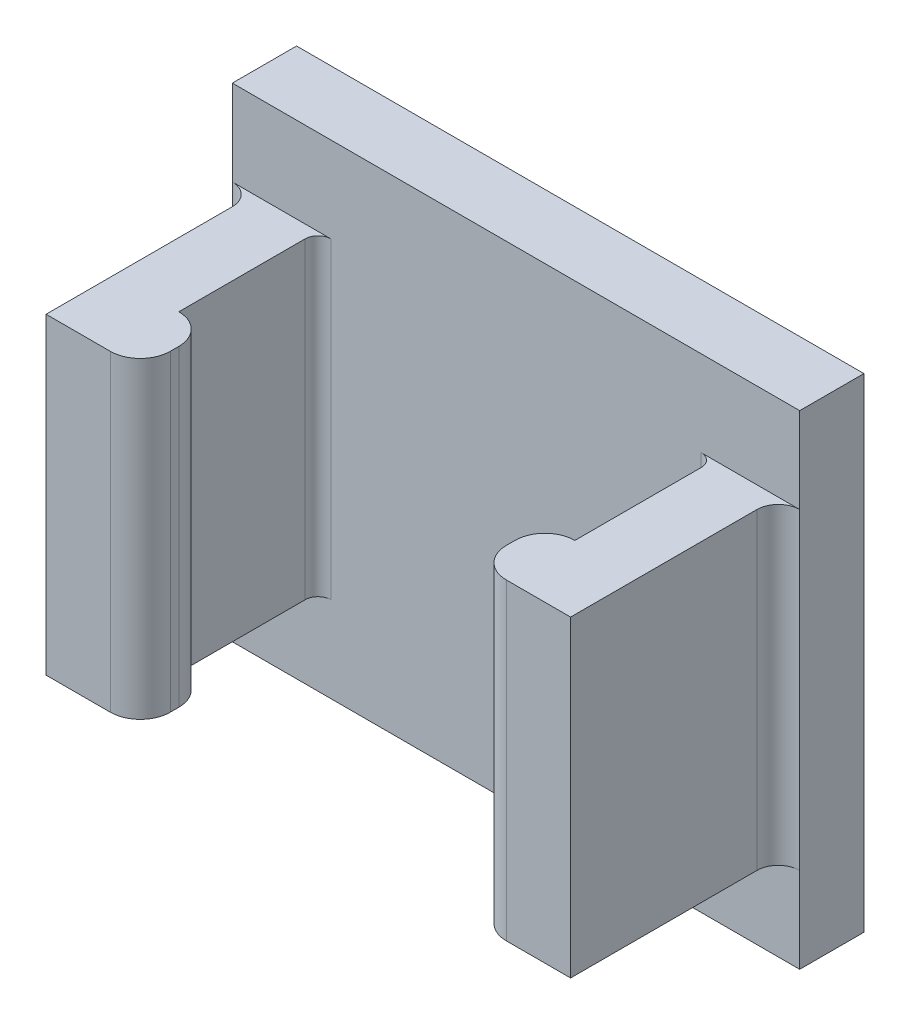
ISO-10303-21;
HEADER;
FILE_DESCRIPTION(('STEP AP214'),'2;1');
FILE_NAME('part.step','',(''),(''),'','','');
FILE_SCHEMA(('AUTOMOTIVE_DESIGN { 1 0 10303 214 1 1 1 1 }'));
ENDSEC;
DATA;
#1=APPLICATION_CONTEXT('core data for automotive mechanical design processes');
#2=APPLICATION_PROTOCOL_DEFINITION('international standard','automotive_design',2000,#1);
#3=PRODUCT_CONTEXT('',#1,'mechanical');
#4=PRODUCT('Part','Part','',(#3));
#5=PRODUCT_RELATED_PRODUCT_CATEGORY('part','',(#4));
#6=PRODUCT_DEFINITION_FORMATION('','',#4);
#7=PRODUCT_DEFINITION_CONTEXT('part definition',#1,'design');
#8=PRODUCT_DEFINITION('design','',#6,#7);
#9=PRODUCT_DEFINITION_SHAPE('','',#8);
#10=(LENGTH_UNIT() NAMED_UNIT(*) SI_UNIT(.MILLI.,.METRE.));
#11=(NAMED_UNIT(*) PLANE_ANGLE_UNIT() SI_UNIT($,.RADIAN.));
#12=(NAMED_UNIT(*) SI_UNIT($,.STERADIAN.) SOLID_ANGLE_UNIT());
#13=UNCERTAINTY_MEASURE_WITH_UNIT(LENGTH_MEASURE(1.E-05),#10,'distance_accuracy_value','');
#14=(GEOMETRIC_REPRESENTATION_CONTEXT(3) GLOBAL_UNCERTAINTY_ASSIGNED_CONTEXT((#13)) GLOBAL_UNIT_ASSIGNED_CONTEXT((#10,
#11,#12)) REPRESENTATION_CONTEXT('',''));
#15=CARTESIAN_POINT('',(0.,0.,0.));
#16=DIRECTION('',(0.,0.,1.));
#17=DIRECTION('',(1.,0.,0.));
#18=AXIS2_PLACEMENT_3D('',#15,#16,#17);
#19=CARTESIAN_POINT('',(-6.125,-5.65,2.5));
#20=DIRECTION('',(1.,0.,0.));
#21=DIRECTION('',(0.,0.,-1.));
#22=AXIS2_PLACEMENT_3D('',#19,#20,#21);
#23=PLANE('',#22);
#24=DIRECTION('',(0.,0.,1.));
#25=VECTOR('',#24,1.);
#26=CARTESIAN_POINT('',(-6.125,3.65,6.35));
#27=LINE('',#26,#25);
#28=CARTESIAN_POINT('',(-6.125,3.65,2.));
#29=VERTEX_POINT('',#28);
#30=CARTESIAN_POINT('',(-6.125,3.65,6.35));
#31=VERTEX_POINT('',#30);
#32=EDGE_CURVE('E279',#29,#31,#27,.T.);
#33=ORIENTED_EDGE('',*,*,#32,.F.);
#34=DIRECTION('',(0.,1.,0.));
#35=VECTOR('',#34,1.);
#36=CARTESIAN_POINT('',(-6.125,-3.65,2.));
#37=LINE('',#36,#35);
#38=CARTESIAN_POINT('',(-6.125,-3.65,2.));
#39=VERTEX_POINT('',#38);
#40=EDGE_CURVE('E361',#29,#39,#37,.F.);
#41=ORIENTED_EDGE('',*,*,#40,.T.);
#42=DIRECTION('',(0.,0.,-1.));
#43=VECTOR('',#42,1.);
#44=CARTESIAN_POINT('',(-6.125,-3.65,6.35));
#45=LINE('',#44,#43);
#46=CARTESIAN_POINT('',(-6.125,-3.65,6.35));
#47=VERTEX_POINT('',#46);
#48=EDGE_CURVE('E247',#47,#39,#45,.T.);
#49=ORIENTED_EDGE('',*,*,#48,.F.);
#50=DIRECTION('',(0.,-1.,0.));
#51=VECTOR('',#50,1.);
#52=CARTESIAN_POINT('',(-6.125,5.65,6.35));
#53=LINE('',#52,#51);
#54=EDGE_CURVE('E325',#31,#47,#53,.T.);
#55=ORIENTED_EDGE('',*,*,#54,.F.);
#56=EDGE_LOOP('',(#33,#41,#49,#55));
#57=FACE_BOUND('',#56,.T.);
#58=ADVANCED_FACE('F41',(#57),#23,.F.);
#59=CARTESIAN_POINT('',(6.125,-5.65,2.5));
#60=DIRECTION('',(-1.,0.,0.));
#61=DIRECTION('',(0.,0.,1.));
#62=AXIS2_PLACEMENT_3D('',#59,#60,#61);
#63=PLANE('',#62);
#64=DIRECTION('',(0.,0.,1.));
#65=VECTOR('',#64,1.);
#66=CARTESIAN_POINT('',(6.125,-3.65,6.35));
#67=LINE('',#66,#65);
#68=CARTESIAN_POINT('',(6.125,-3.65,2.));
#69=VERTEX_POINT('',#68);
#70=CARTESIAN_POINT('',(6.125,-3.65,6.35));
#71=VERTEX_POINT('',#70);
#72=EDGE_CURVE('E255',#69,#71,#67,.T.);
#73=ORIENTED_EDGE('',*,*,#72,.F.);
#74=DIRECTION('',(0.,-1.,0.));
#75=VECTOR('',#74,1.);
#76=CARTESIAN_POINT('',(6.125,3.65,2.));
#77=LINE('',#76,#75);
#78=CARTESIAN_POINT('',(6.125,3.65,2.));
#79=VERTEX_POINT('',#78);
#80=EDGE_CURVE('E358',#69,#79,#77,.F.);
#81=ORIENTED_EDGE('',*,*,#80,.T.);
#82=DIRECTION('',(0.,0.,-1.));
#83=VECTOR('',#82,1.);
#84=CARTESIAN_POINT('',(6.125,3.65,6.35));
#85=LINE('',#84,#83);
#86=CARTESIAN_POINT('',(6.125,3.65,6.35));
#87=VERTEX_POINT('',#86);
#88=EDGE_CURVE('E287',#87,#79,#85,.T.);
#89=ORIENTED_EDGE('',*,*,#88,.F.);
#90=DIRECTION('',(0.,1.,0.));
#91=VECTOR('',#90,1.);
#92=CARTESIAN_POINT('',(6.125,5.65,6.35));
#93=LINE('',#92,#91);
#94=EDGE_CURVE('E216',#71,#87,#93,.T.);
#95=ORIENTED_EDGE('',*,*,#94,.F.);
#96=EDGE_LOOP('',(#73,#81,#89,#95));
#97=FACE_BOUND('',#96,.T.);
#98=ADVANCED_FACE('F506',(#97),#63,.F.);
#99=CARTESIAN_POINT('',(4.625,5.65,6.35));
#100=DIRECTION('',(1.,0.,0.));
#101=DIRECTION('',(0.,1.,0.));
#102=AXIS2_PLACEMENT_3D('',#99,#100,#101);
#103=PLANE('',#102);
#104=DIRECTION('',(0.,0.,-1.));
#105=VECTOR('',#104,1.);
#106=CARTESIAN_POINT('',(4.625,-3.65,6.35));
#107=LINE('',#106,#105);
#108=CARTESIAN_POINT('',(4.625,-3.65,4.75));
#109=VERTEX_POINT('',#108);
#110=CARTESIAN_POINT('',(4.625,-3.65,1.8));
#111=VERTEX_POINT('',#110);
#112=EDGE_CURVE('E272',#109,#111,#107,.T.);
#113=ORIENTED_EDGE('',*,*,#112,.F.);
#114=DIRECTION('',(0.,-1.,0.));
#115=VECTOR('',#114,1.);
#116=CARTESIAN_POINT('',(4.625,-5.65,4.75));
#117=LINE('',#116,#115);
#118=CARTESIAN_POINT('',(4.625,3.65,4.75));
#119=VERTEX_POINT('',#118);
#120=EDGE_CURVE('E315',#119,#109,#117,.T.);
#121=ORIENTED_EDGE('',*,*,#120,.F.);
#122=DIRECTION('',(0.,0.,-1.));
#123=VECTOR('',#122,1.);
#124=CARTESIAN_POINT('',(4.625,3.65,6.35));
#125=LINE('',#124,#123);
#126=CARTESIAN_POINT('',(4.625,3.65,1.8));
#127=VERTEX_POINT('',#126);
#128=EDGE_CURVE('E308',#119,#127,#125,.T.);
#129=ORIENTED_EDGE('',*,*,#128,.T.);
#130=DIRECTION('',(0.,1.,0.));
#131=VECTOR('',#130,1.);
#132=CARTESIAN_POINT('',(4.625,-5.65,1.8));
#133=LINE('',#132,#131);
#134=EDGE_CURVE('E344',#127,#111,#133,.F.);
#135=ORIENTED_EDGE('',*,*,#134,.T.);
#136=EDGE_LOOP('',(#113,#121,#129,#135));
#137=FACE_BOUND('',#136,.T.);
#138=ADVANCED_FACE('F433',(#137),#103,.F.);
#139=CARTESIAN_POINT('',(-4.625,5.65,6.35));
#140=DIRECTION('',(-1.,0.,0.));
#141=DIRECTION('',(0.,-1.,0.));
#142=AXIS2_PLACEMENT_3D('',#139,#140,#141);
#143=PLANE('',#142);
#144=DIRECTION('',(0.,0.,1.));
#145=VECTOR('',#144,1.);
#146=CARTESIAN_POINT('',(-4.625,-3.65,6.35));
#147=LINE('',#146,#145);
#148=CARTESIAN_POINT('',(-4.625,-3.65,1.8));
#149=VERTEX_POINT('',#148);
#150=CARTESIAN_POINT('',(-4.625,-3.65,4.75));
#151=VERTEX_POINT('',#150);
#152=EDGE_CURVE('E262',#149,#151,#147,.T.);
#153=ORIENTED_EDGE('',*,*,#152,.F.);
#154=DIRECTION('',(0.,-1.,0.));
#155=VECTOR('',#154,1.);
#156=CARTESIAN_POINT('',(-4.625,5.65,1.8));
#157=LINE('',#156,#155);
#158=CARTESIAN_POINT('',(-4.625,3.65,1.8));
#159=VERTEX_POINT('',#158);
#160=EDGE_CURVE('E348',#149,#159,#157,.F.);
#161=ORIENTED_EDGE('',*,*,#160,.T.);
#162=DIRECTION('',(0.,0.,1.));
#163=VECTOR('',#162,1.);
#164=CARTESIAN_POINT('',(-4.625,3.65,6.35));
#165=LINE('',#164,#163);
#166=CARTESIAN_POINT('',(-4.625,3.65,4.75));
#167=VERTEX_POINT('',#166);
#168=EDGE_CURVE('E296',#159,#167,#165,.T.);
#169=ORIENTED_EDGE('',*,*,#168,.T.);
#170=DIRECTION('',(0.,1.,0.));
#171=VECTOR('',#170,1.);
#172=CARTESIAN_POINT('',(-4.625,5.65,4.75));
#173=LINE('',#172,#171);
#174=EDGE_CURVE('E217',#151,#167,#173,.T.);
#175=ORIENTED_EDGE('',*,*,#174,.F.);
#176=EDGE_LOOP('',(#153,#161,#169,#175));
#177=FACE_BOUND('',#176,.T.);
#178=ADVANCED_FACE('F491',(#177),#143,.F.);
#179=CARTESIAN_POINT('',(0.,0.,6.35));
#180=DIRECTION('',(0.,0.,1.));
#181=DIRECTION('',(1.,0.,0.));
#182=AXIS2_PLACEMENT_3D('',#179,#180,#181);
#183=PLANE('',#182);
#184=DIRECTION('',(-1.,0.,0.));
#185=VECTOR('',#184,1.);
#186=CARTESIAN_POINT('',(-6.125,-3.65,6.35));
#187=LINE('',#186,#185);
#188=CARTESIAN_POINT('',(-4.625,-3.65,6.35));
#189=VERTEX_POINT('',#188);
#190=EDGE_CURVE('E258',#189,#47,#187,.T.);
#191=ORIENTED_EDGE('',*,*,#190,.F.);
#192=DIRECTION('',(0.,-1.,0.));
#193=VECTOR('',#192,1.);
#194=CARTESIAN_POINT('',(-4.625,0.,6.35));
#195=LINE('',#194,#193);
#196=CARTESIAN_POINT('',(-4.625,3.65,6.35));
#197=VERTEX_POINT('',#196);
#198=EDGE_CURVE('E392',#189,#197,#195,.F.);
#199=ORIENTED_EDGE('',*,*,#198,.T.);
#200=DIRECTION('',(1.,0.,0.));
#201=VECTOR('',#200,1.);
#202=CARTESIAN_POINT('',(-6.125,3.65,6.35));
#203=LINE('',#202,#201);
#204=EDGE_CURVE('E283',#31,#197,#203,.T.);
#205=ORIENTED_EDGE('',*,*,#204,.F.);
#206=ORIENTED_EDGE('',*,*,#54,.T.);
#207=EDGE_LOOP('',(#191,#199,#205,#206));
#208=FACE_BOUND('',#207,.T.);
#209=ADVANCED_FACE('F471',(#208),#183,.T.);
#210=CARTESIAN_POINT('',(0.,0.,6.35));
#211=DIRECTION('',(0.,0.,-1.));
#212=DIRECTION('',(-1.,0.,0.));
#213=AXIS2_PLACEMENT_3D('',#210,#211,#212);
#214=PLANE('',#213);
#215=CARTESIAN_POINT('',(4.625,3.65,6.35));
#216=VERTEX_POINT('',#215);
#217=EDGE_CURVE('E282',#216,#87,#203,.T.);
#218=ORIENTED_EDGE('',*,*,#217,.F.);
#219=DIRECTION('',(0.,1.,0.));
#220=VECTOR('',#219,1.);
#221=CARTESIAN_POINT('',(4.625,-3.65,6.35));
#222=LINE('',#221,#220);
#223=CARTESIAN_POINT('',(4.625,-3.65,6.35));
#224=VERTEX_POINT('',#223);
#225=EDGE_CURVE('E11',#216,#224,#222,.F.);
#226=ORIENTED_EDGE('',*,*,#225,.T.);
#227=EDGE_CURVE('E259',#71,#224,#187,.T.);
#228=ORIENTED_EDGE('',*,*,#227,.F.);
#229=ORIENTED_EDGE('',*,*,#94,.T.);
#230=EDGE_LOOP('',(#218,#226,#228,#229));
#231=FACE_BOUND('',#230,.T.);
#232=ADVANCED_FACE('F503',(#231),#214,.F.);
#233=CARTESIAN_POINT('',(-3.925,0.,0.));
#234=DIRECTION('',(1.,0.,0.));
#235=DIRECTION('',(0.,1.,0.));
#236=AXIS2_PLACEMENT_3D('',#233,#234,#235);
#237=PLANE('',#236);
#238=DIRECTION('',(0.,0.,-1.));
#239=VECTOR('',#238,1.);
#240=CARTESIAN_POINT('',(-3.925,3.65,0.));
#241=LINE('',#240,#239);
#242=CARTESIAN_POINT('',(-3.925,3.65,5.65));
#243=VERTEX_POINT('',#242);
#244=CARTESIAN_POINT('',(-3.925,3.65,5.45));
#245=VERTEX_POINT('',#244);
#246=EDGE_CURVE('E300',#243,#245,#241,.T.);
#247=ORIENTED_EDGE('',*,*,#246,.F.);
#248=DIRECTION('',(0.,-1.,0.));
#249=VECTOR('',#248,1.);
#250=CARTESIAN_POINT('',(-3.925,0.,5.65));
#251=LINE('',#250,#249);
#252=CARTESIAN_POINT('',(-3.925,-3.65,5.65));
#253=VERTEX_POINT('',#252);
#254=EDGE_CURVE('E382',#243,#253,#251,.T.);
#255=ORIENTED_EDGE('',*,*,#254,.T.);
#256=DIRECTION('',(0.,0.,-1.));
#257=VECTOR('',#256,1.);
#258=CARTESIAN_POINT('',(-3.925,-3.65,0.));
#259=LINE('',#258,#257);
#260=CARTESIAN_POINT('',(-3.925,-3.65,5.45));
#261=VERTEX_POINT('',#260);
#262=EDGE_CURVE('E265',#253,#261,#259,.T.);
#263=ORIENTED_EDGE('',*,*,#262,.T.);
#264=DIRECTION('',(0.,1.,0.));
#265=VECTOR('',#264,1.);
#266=CARTESIAN_POINT('',(-3.925,3.65,5.45));
#267=LINE('',#266,#265);
#268=EDGE_CURVE('E378',#261,#245,#267,.T.);
#269=ORIENTED_EDGE('',*,*,#268,.T.);
#270=EDGE_LOOP('',(#247,#255,#263,#269));
#271=FACE_BOUND('',#270,.T.);
#272=ADVANCED_FACE('F480',(#271),#237,.T.);
#273=CARTESIAN_POINT('',(3.925,0.,0.));
#274=DIRECTION('',(-1.,0.,0.));
#275=DIRECTION('',(0.,-1.,0.));
#276=AXIS2_PLACEMENT_3D('',#273,#274,#275);
#277=PLANE('',#276);
#278=DIRECTION('',(0.,0.,1.));
#279=VECTOR('',#278,1.);
#280=CARTESIAN_POINT('',(3.925,3.65,0.));
#281=LINE('',#280,#279);
#282=CARTESIAN_POINT('',(3.925,3.65,5.45));
#283=VERTEX_POINT('',#282);
#284=CARTESIAN_POINT('',(3.925,3.65,5.65));
#285=VERTEX_POINT('',#284);
#286=EDGE_CURVE('E312',#283,#285,#281,.T.);
#287=ORIENTED_EDGE('',*,*,#286,.F.);
#288=DIRECTION('',(0.,-1.,0.));
#289=VECTOR('',#288,1.);
#290=CARTESIAN_POINT('',(3.925,-3.65,5.45));
#291=LINE('',#290,#289);
#292=CARTESIAN_POINT('',(3.925,-3.65,5.45));
#293=VERTEX_POINT('',#292);
#294=EDGE_CURVE('E405',#283,#293,#291,.T.);
#295=ORIENTED_EDGE('',*,*,#294,.T.);
#296=DIRECTION('',(0.,0.,1.));
#297=VECTOR('',#296,1.);
#298=CARTESIAN_POINT('',(3.925,-3.65,0.));
#299=LINE('',#298,#297);
#300=CARTESIAN_POINT('',(3.925,-3.65,5.65));
#301=VERTEX_POINT('',#300);
#302=EDGE_CURVE('E275',#293,#301,#299,.T.);
#303=ORIENTED_EDGE('',*,*,#302,.T.);
#304=DIRECTION('',(0.,1.,0.));
#305=VECTOR('',#304,1.);
#306=CARTESIAN_POINT('',(3.925,3.65,5.65));
#307=LINE('',#306,#305);
#308=EDGE_CURVE('E401',#301,#285,#307,.T.);
#309=ORIENTED_EDGE('',*,*,#308,.T.);
#310=EDGE_LOOP('',(#287,#295,#303,#309));
#311=FACE_BOUND('',#310,.T.);
#312=ADVANCED_FACE('F424',(#311),#277,.T.);
#313=CARTESIAN_POINT('',(4.325,0.,1.8));
#314=DIRECTION('',(0.,-1.,0.));
#315=DIRECTION('',(1.,0.,0.));
#316=AXIS2_PLACEMENT_3D('',#313,#314,#315);
#317=CYLINDRICAL_SURFACE('',#316,0.3);
#318=CARTESIAN_POINT('',(4.325,-3.65,1.8));
#319=DIRECTION('',(0.,-1.,0.));
#320=DIRECTION('',(0.,0.,-1.));
#321=AXIS2_PLACEMENT_3D('',#318,#319,#320);
#322=CIRCLE('',#321,0.3);
#323=CARTESIAN_POINT('',(4.325,-3.65,1.5));
#324=VERTEX_POINT('',#323);
#325=EDGE_CURVE('E269',#111,#324,#322,.F.);
#326=ORIENTED_EDGE('',*,*,#325,.F.);
#327=ORIENTED_EDGE('',*,*,#134,.F.);
#328=CARTESIAN_POINT('',(4.325,3.65,1.8));
#329=DIRECTION('',(0.,-1.,0.));
#330=DIRECTION('',(0.,0.,-1.));
#331=AXIS2_PLACEMENT_3D('',#328,#329,#330);
#332=CIRCLE('',#331,0.3);
#333=CARTESIAN_POINT('',(4.325,3.65,1.5));
#334=VERTEX_POINT('',#333);
#335=EDGE_CURVE('E304',#127,#334,#332,.F.);
#336=ORIENTED_EDGE('',*,*,#335,.T.);
#337=DIRECTION('',(0.,1.,0.));
#338=VECTOR('',#337,1.);
#339=CARTESIAN_POINT('',(4.325,5.65,1.5));
#340=LINE('',#339,#338);
#341=EDGE_CURVE('E341',#324,#334,#340,.T.);
#342=ORIENTED_EDGE('',*,*,#341,.F.);
#343=EDGE_LOOP('',(#326,#327,#336,#342));
#344=FACE_BOUND('',#343,.T.);
#345=ADVANCED_FACE('F436',(#344),#317,.F.);
#346=CARTESIAN_POINT('',(-4.325,0.,1.8));
#347=DIRECTION('',(0.,1.,0.));
#348=DIRECTION('',(-1.,0.,0.));
#349=AXIS2_PLACEMENT_3D('',#346,#347,#348);
#350=CYLINDRICAL_SURFACE('',#349,0.3);
#351=CARTESIAN_POINT('',(-4.325,-3.65,1.8));
#352=DIRECTION('',(0.,-1.,0.));
#353=DIRECTION('',(0.,0.,-1.));
#354=AXIS2_PLACEMENT_3D('',#351,#352,#353);
#355=CIRCLE('',#354,0.3);
#356=CARTESIAN_POINT('',(-4.325,-3.65,1.5));
#357=VERTEX_POINT('',#356);
#358=EDGE_CURVE('E355',#357,#149,#355,.F.);
#359=ORIENTED_EDGE('',*,*,#358,.F.);
#360=DIRECTION('',(0.,-1.,0.));
#361=VECTOR('',#360,1.);
#362=CARTESIAN_POINT('',(-4.325,-5.65,1.5));
#363=LINE('',#362,#361);
#364=CARTESIAN_POINT('',(-4.325,3.65,1.5));
#365=VERTEX_POINT('',#364);
#366=EDGE_CURVE('E337',#365,#357,#363,.T.);
#367=ORIENTED_EDGE('',*,*,#366,.F.);
#368=CARTESIAN_POINT('',(-4.325,3.65,1.8));
#369=DIRECTION('',(0.,-1.,0.));
#370=DIRECTION('',(0.,0.,-1.));
#371=AXIS2_PLACEMENT_3D('',#368,#369,#370);
#372=CIRCLE('',#371,0.3);
#373=EDGE_CURVE('E351',#365,#159,#372,.F.);
#374=ORIENTED_EDGE('',*,*,#373,.T.);
#375=ORIENTED_EDGE('',*,*,#160,.F.);
#376=EDGE_LOOP('',(#359,#367,#374,#375));
#377=FACE_BOUND('',#376,.T.);
#378=ADVANCED_FACE('F495',(#377),#350,.F.);
#379=CARTESIAN_POINT('',(-6.125,5.65,2.5));
#380=DIRECTION('',(0.,-1.,0.));
#381=DIRECTION('',(0.,0.,-1.));
#382=AXIS2_PLACEMENT_3D('',#379,#380,#381);
#383=PLANE('',#382);
#384=DIRECTION('',(-1.,0.,0.));
#385=VECTOR('',#384,1.);
#386=CARTESIAN_POINT('',(-6.125,5.65,0.));
#387=LINE('',#386,#385);
#388=CARTESIAN_POINT('',(6.625,5.65,0.));
#389=VERTEX_POINT('',#388);
#390=CARTESIAN_POINT('',(-6.625,5.65,0.));
#391=VERTEX_POINT('',#390);
#392=EDGE_CURVE('E220',#389,#391,#387,.T.);
#393=ORIENTED_EDGE('',*,*,#392,.T.);
#394=DIRECTION('',(0.,0.,-1.));
#395=VECTOR('',#394,1.);
#396=CARTESIAN_POINT('',(-6.625,5.65,1.5));
#397=LINE('',#396,#395);
#398=CARTESIAN_POINT('',(-6.625,5.65,1.5));
#399=VERTEX_POINT('',#398);
#400=EDGE_CURVE('E197',#399,#391,#397,.T.);
#401=ORIENTED_EDGE('',*,*,#400,.F.);
#402=DIRECTION('',(1.,0.,0.));
#403=VECTOR('',#402,1.);
#404=CARTESIAN_POINT('',(-6.125,5.65,1.5));
#405=LINE('',#404,#403);
#406=CARTESIAN_POINT('',(6.625,5.65,1.5));
#407=VERTEX_POINT('',#406);
#408=EDGE_CURVE('E207',#399,#407,#405,.T.);
#409=ORIENTED_EDGE('',*,*,#408,.T.);
#410=DIRECTION('',(0.,0.,1.));
#411=VECTOR('',#410,1.);
#412=CARTESIAN_POINT('',(6.625,5.65,1.5));
#413=LINE('',#412,#411);
#414=EDGE_CURVE('E244',#389,#407,#413,.T.);
#415=ORIENTED_EDGE('',*,*,#414,.F.);
#416=EDGE_LOOP('',(#393,#401,#409,#415));
#417=FACE_BOUND('',#416,.T.);
#418=ADVANCED_FACE('F219',(#417),#383,.F.);
#419=CARTESIAN_POINT('',(-6.125,-5.65,2.5));
#420=DIRECTION('',(0.,1.,0.));
#421=DIRECTION('',(0.,0.,1.));
#422=AXIS2_PLACEMENT_3D('',#419,#420,#421);
#423=PLANE('',#422);
#424=DIRECTION('',(1.,0.,0.));
#425=VECTOR('',#424,1.);
#426=CARTESIAN_POINT('',(-6.125,-5.65,0.));
#427=LINE('',#426,#425);
#428=CARTESIAN_POINT('',(-6.625,-5.65,0.));
#429=VERTEX_POINT('',#428);
#430=CARTESIAN_POINT('',(6.625,-5.65,0.));
#431=VERTEX_POINT('',#430);
#432=EDGE_CURVE('E331',#429,#431,#427,.T.);
#433=ORIENTED_EDGE('',*,*,#432,.T.);
#434=DIRECTION('',(0.,0.,-1.));
#435=VECTOR('',#434,1.);
#436=CARTESIAN_POINT('',(6.625,-5.65,1.5));
#437=LINE('',#436,#435);
#438=CARTESIAN_POINT('',(6.625,-5.65,1.5));
#439=VERTEX_POINT('',#438);
#440=EDGE_CURVE('E235',#439,#431,#437,.T.);
#441=ORIENTED_EDGE('',*,*,#440,.F.);
#442=DIRECTION('',(-1.,0.,0.));
#443=VECTOR('',#442,1.);
#444=CARTESIAN_POINT('',(-6.125,-5.65,1.5));
#445=LINE('',#444,#443);
#446=CARTESIAN_POINT('',(-6.625,-5.65,1.5));
#447=VERTEX_POINT('',#446);
#448=EDGE_CURVE('E334',#439,#447,#445,.T.);
#449=ORIENTED_EDGE('',*,*,#448,.T.);
#450=DIRECTION('',(0.,0.,1.));
#451=VECTOR('',#450,1.);
#452=CARTESIAN_POINT('',(-6.625,-5.65,1.5));
#453=LINE('',#452,#451);
#454=EDGE_CURVE('E226',#429,#447,#453,.T.);
#455=ORIENTED_EDGE('',*,*,#454,.F.);
#456=EDGE_LOOP('',(#433,#441,#449,#455));
#457=FACE_BOUND('',#456,.T.);
#458=ADVANCED_FACE('F453',(#457),#423,.F.);
#459=CARTESIAN_POINT('',(0.,0.,0.));
#460=DIRECTION('',(0.,0.,-1.));
#461=DIRECTION('',(-1.,0.,0.));
#462=AXIS2_PLACEMENT_3D('',#459,#460,#461);
#463=PLANE('',#462);
#464=ORIENTED_EDGE('',*,*,#392,.F.);
#465=DIRECTION('',(0.,1.,0.));
#466=VECTOR('',#465,1.);
#467=CARTESIAN_POINT('',(6.625,5.65,0.));
#468=LINE('',#467,#466);
#469=EDGE_CURVE('E240',#431,#389,#468,.T.);
#470=ORIENTED_EDGE('',*,*,#469,.F.);
#471=ORIENTED_EDGE('',*,*,#432,.F.);
#472=DIRECTION('',(0.,-1.,0.));
#473=VECTOR('',#472,1.);
#474=CARTESIAN_POINT('',(-6.625,5.65,0.));
#475=LINE('',#474,#473);
#476=EDGE_CURVE('E222',#391,#429,#475,.T.);
#477=ORIENTED_EDGE('',*,*,#476,.F.);
#478=EDGE_LOOP('',(#464,#470,#471,#477));
#479=FACE_BOUND('',#478,.T.);
#480=ADVANCED_FACE('F455',(#479),#463,.T.);
#481=CARTESIAN_POINT('',(0.,0.,1.5));
#482=DIRECTION('',(0.,0.,-1.));
#483=DIRECTION('',(-1.,0.,0.));
#484=AXIS2_PLACEMENT_3D('',#481,#482,#483);
#485=PLANE('',#484);
#486=DIRECTION('',(0.,-1.,0.));
#487=VECTOR('',#486,1.);
#488=CARTESIAN_POINT('',(6.625,5.65,1.5));
#489=LINE('',#488,#487);
#490=CARTESIAN_POINT('',(6.625,-3.65,1.5));
#491=VERTEX_POINT('',#490);
#492=EDGE_CURVE('E232',#491,#439,#489,.T.);
#493=ORIENTED_EDGE('',*,*,#492,.F.);
#494=DIRECTION('',(1.,0.,0.));
#495=VECTOR('',#494,1.);
#496=CARTESIAN_POINT('',(-6.125,-3.65,1.5));
#497=LINE('',#496,#495);
#498=EDGE_CURVE('E251',#324,#491,#497,.T.);
#499=ORIENTED_EDGE('',*,*,#498,.F.);
#500=ORIENTED_EDGE('',*,*,#341,.T.);
#501=DIRECTION('',(-1.,0.,0.));
#502=VECTOR('',#501,1.);
#503=CARTESIAN_POINT('',(-6.125,3.65,1.5));
#504=LINE('',#503,#502);
#505=CARTESIAN_POINT('',(6.625,3.65,1.5));
#506=VERTEX_POINT('',#505);
#507=EDGE_CURVE('E292',#506,#334,#504,.T.);
#508=ORIENTED_EDGE('',*,*,#507,.F.);
#509=EDGE_CURVE('E211',#407,#506,#489,.T.);
#510=ORIENTED_EDGE('',*,*,#509,.F.);
#511=ORIENTED_EDGE('',*,*,#408,.F.);
#512=DIRECTION('',(0.,1.,0.));
#513=VECTOR('',#512,1.);
#514=CARTESIAN_POINT('',(-6.625,5.65,1.5));
#515=LINE('',#514,#513);
#516=CARTESIAN_POINT('',(-6.625,3.65,1.5));
#517=VERTEX_POINT('',#516);
#518=EDGE_CURVE('E191',#517,#399,#515,.T.);
#519=ORIENTED_EDGE('',*,*,#518,.F.);
#520=EDGE_CURVE('E291',#365,#517,#504,.T.);
#521=ORIENTED_EDGE('',*,*,#520,.F.);
#522=ORIENTED_EDGE('',*,*,#366,.T.);
#523=CARTESIAN_POINT('',(-6.625,-3.65,1.5));
#524=VERTEX_POINT('',#523);
#525=EDGE_CURVE('E252',#524,#357,#497,.T.);
#526=ORIENTED_EDGE('',*,*,#525,.F.);
#527=EDGE_CURVE('E205',#447,#524,#515,.T.);
#528=ORIENTED_EDGE('',*,*,#527,.F.);
#529=ORIENTED_EDGE('',*,*,#448,.F.);
#530=EDGE_LOOP('',(#493,#499,#500,#508,#510,#511,#519,#521,#522,#526,#528,#529));
#531=FACE_BOUND('',#530,.T.);
#532=ADVANCED_FACE('F209',(#531),#485,.F.);
#533=CARTESIAN_POINT('',(0.,3.65,0.));
#534=DIRECTION('',(0.,-1.,0.));
#535=DIRECTION('',(0.,0.,-1.));
#536=AXIS2_PLACEMENT_3D('',#533,#534,#535);
#537=PLANE('',#536);
#538=ORIENTED_EDGE('',*,*,#204,.T.);
#539=CARTESIAN_POINT('',(-4.625,3.65,5.65));
#540=DIRECTION('',(0.,-1.,0.));
#541=DIRECTION('',(0.,0.,-1.));
#542=AXIS2_PLACEMENT_3D('',#539,#540,#541);
#543=CIRCLE('',#542,0.7);
#544=EDGE_CURVE('E398',#197,#243,#543,.F.);
#545=ORIENTED_EDGE('',*,*,#544,.T.);
#546=ORIENTED_EDGE('',*,*,#246,.T.);
#547=CARTESIAN_POINT('',(-4.625,3.65,5.45));
#548=DIRECTION('',(0.,-1.,0.));
#549=DIRECTION('',(0.,0.,-1.));
#550=AXIS2_PLACEMENT_3D('',#547,#548,#549);
#551=CIRCLE('',#550,0.7);
#552=EDGE_CURVE('E395',#245,#167,#551,.F.);
#553=ORIENTED_EDGE('',*,*,#552,.T.);
#554=ORIENTED_EDGE('',*,*,#168,.F.);
#555=ORIENTED_EDGE('',*,*,#373,.F.);
#556=ORIENTED_EDGE('',*,*,#520,.T.);
#557=CARTESIAN_POINT('',(-6.625,3.65,2.));
#558=DIRECTION('',(0.,-1.,0.));
#559=DIRECTION('',(0.,0.,-1.));
#560=AXIS2_PLACEMENT_3D('',#557,#558,#559);
#561=CIRCLE('',#560,0.5);
#562=EDGE_CURVE('E371',#517,#29,#561,.T.);
#563=ORIENTED_EDGE('',*,*,#562,.T.);
#564=ORIENTED_EDGE('',*,*,#32,.T.);
#565=EDGE_LOOP('',(#538,#545,#546,#553,#554,#555,#556,#563,#564));
#566=FACE_BOUND('',#565,.T.);
#567=ADVANCED_FACE('F464',(#566),#537,.F.);
#568=ORIENTED_EDGE('',*,*,#128,.F.);
#569=CARTESIAN_POINT('',(4.625,3.65,5.45));
#570=DIRECTION('',(0.,-1.,0.));
#571=DIRECTION('',(0.,0.,-1.));
#572=AXIS2_PLACEMENT_3D('',#569,#570,#571);
#573=CIRCLE('',#572,0.7);
#574=EDGE_CURVE('E50',#119,#283,#573,.F.);
#575=ORIENTED_EDGE('',*,*,#574,.T.);
#576=ORIENTED_EDGE('',*,*,#286,.T.);
#577=CARTESIAN_POINT('',(4.625,3.65,5.65));
#578=DIRECTION('',(0.,-1.,0.));
#579=DIRECTION('',(0.,0.,-1.));
#580=AXIS2_PLACEMENT_3D('',#577,#578,#579);
#581=CIRCLE('',#580,0.7);
#582=EDGE_CURVE('E57',#285,#216,#581,.F.);
#583=ORIENTED_EDGE('',*,*,#582,.T.);
#584=ORIENTED_EDGE('',*,*,#217,.T.);
#585=ORIENTED_EDGE('',*,*,#88,.T.);
#586=CARTESIAN_POINT('',(6.625,3.65,2.));
#587=DIRECTION('',(0.,-1.,0.));
#588=DIRECTION('',(0.,0.,-1.));
#589=AXIS2_PLACEMENT_3D('',#586,#587,#588);
#590=CIRCLE('',#589,0.5);
#591=EDGE_CURVE('E367',#79,#506,#590,.T.);
#592=ORIENTED_EDGE('',*,*,#591,.T.);
#593=ORIENTED_EDGE('',*,*,#507,.T.);
#594=ORIENTED_EDGE('',*,*,#335,.F.);
#595=EDGE_LOOP('',(#568,#575,#576,#583,#584,#585,#592,#593,#594));
#596=FACE_BOUND('',#595,.T.);
#597=ADVANCED_FACE('F419',(#596),#537,.F.);
#598=CARTESIAN_POINT('',(0.,-3.65,0.));
#599=DIRECTION('',(0.,-1.,0.));
#600=DIRECTION('',(0.,0.,-1.));
#601=AXIS2_PLACEMENT_3D('',#598,#599,#600);
#602=PLANE('',#601);
#603=ORIENTED_EDGE('',*,*,#262,.F.);
#604=CARTESIAN_POINT('',(-4.625,-3.65,5.65));
#605=DIRECTION('',(0.,-1.,0.));
#606=DIRECTION('',(0.,0.,-1.));
#607=AXIS2_PLACEMENT_3D('',#604,#605,#606);
#608=CIRCLE('',#607,0.7);
#609=EDGE_CURVE('E389',#253,#189,#608,.T.);
#610=ORIENTED_EDGE('',*,*,#609,.T.);
#611=ORIENTED_EDGE('',*,*,#190,.T.);
#612=ORIENTED_EDGE('',*,*,#48,.T.);
#613=CARTESIAN_POINT('',(-6.625,-3.65,2.));
#614=DIRECTION('',(0.,-1.,0.));
#615=DIRECTION('',(0.,0.,-1.));
#616=AXIS2_PLACEMENT_3D('',#613,#614,#615);
#617=CIRCLE('',#616,0.5);
#618=EDGE_CURVE('E374',#39,#524,#617,.F.);
#619=ORIENTED_EDGE('',*,*,#618,.T.);
#620=ORIENTED_EDGE('',*,*,#525,.T.);
#621=ORIENTED_EDGE('',*,*,#358,.T.);
#622=ORIENTED_EDGE('',*,*,#152,.T.);
#623=CARTESIAN_POINT('',(-4.625,-3.65,5.45));
#624=DIRECTION('',(0.,-1.,0.));
#625=DIRECTION('',(0.,0.,-1.));
#626=AXIS2_PLACEMENT_3D('',#623,#624,#625);
#627=CIRCLE('',#626,0.7);
#628=EDGE_CURVE('E386',#151,#261,#627,.T.);
#629=ORIENTED_EDGE('',*,*,#628,.T.);
#630=EDGE_LOOP('',(#603,#610,#611,#612,#619,#620,#621,#622,#629));
#631=FACE_BOUND('',#630,.T.);
#632=ADVANCED_FACE('F483',(#631),#602,.T.);
#633=ORIENTED_EDGE('',*,*,#302,.F.);
#634=CARTESIAN_POINT('',(4.625,-3.65,5.45));
#635=DIRECTION('',(0.,-1.,0.));
#636=DIRECTION('',(0.,0.,-1.));
#637=AXIS2_PLACEMENT_3D('',#634,#635,#636);
#638=CIRCLE('',#637,0.7);
#639=EDGE_CURVE('E412',#293,#109,#638,.T.);
#640=ORIENTED_EDGE('',*,*,#639,.T.);
#641=ORIENTED_EDGE('',*,*,#112,.T.);
#642=ORIENTED_EDGE('',*,*,#325,.T.);
#643=ORIENTED_EDGE('',*,*,#498,.T.);
#644=CARTESIAN_POINT('',(6.625,-3.65,2.));
#645=DIRECTION('',(0.,-1.,0.));
#646=DIRECTION('',(0.,0.,-1.));
#647=AXIS2_PLACEMENT_3D('',#644,#645,#646);
#648=CIRCLE('',#647,0.5);
#649=EDGE_CURVE('E364',#491,#69,#648,.F.);
#650=ORIENTED_EDGE('',*,*,#649,.T.);
#651=ORIENTED_EDGE('',*,*,#72,.T.);
#652=ORIENTED_EDGE('',*,*,#227,.T.);
#653=CARTESIAN_POINT('',(4.625,-3.65,5.65));
#654=DIRECTION('',(0.,-1.,0.));
#655=DIRECTION('',(0.,0.,-1.));
#656=AXIS2_PLACEMENT_3D('',#653,#654,#655);
#657=CIRCLE('',#656,0.7);
#658=EDGE_CURVE('E409',#224,#301,#657,.T.);
#659=ORIENTED_EDGE('',*,*,#658,.T.);
#660=EDGE_LOOP('',(#633,#640,#641,#642,#643,#650,#651,#652,#659));
#661=FACE_BOUND('',#660,.T.);
#662=ADVANCED_FACE('F430',(#661),#602,.T.);
#663=CARTESIAN_POINT('',(6.625,0.,0.));
#664=DIRECTION('',(1.,0.,0.));
#665=DIRECTION('',(0.,0.,-1.));
#666=AXIS2_PLACEMENT_3D('',#663,#664,#665);
#667=PLANE('',#666);
#668=ORIENTED_EDGE('',*,*,#509,.T.);
#669=EDGE_CURVE('E236',#506,#491,#489,.T.);
#670=ORIENTED_EDGE('',*,*,#669,.T.);
#671=ORIENTED_EDGE('',*,*,#492,.T.);
#672=ORIENTED_EDGE('',*,*,#440,.T.);
#673=ORIENTED_EDGE('',*,*,#469,.T.);
#674=ORIENTED_EDGE('',*,*,#414,.T.);
#675=EDGE_LOOP('',(#668,#670,#671,#672,#673,#674));
#676=FACE_BOUND('',#675,.T.);
#677=ADVANCED_FACE('F446',(#676),#667,.T.);
#678=CARTESIAN_POINT('',(-6.625,0.,0.));
#679=DIRECTION('',(1.,0.,0.));
#680=DIRECTION('',(0.,0.,-1.));
#681=AXIS2_PLACEMENT_3D('',#678,#679,#680);
#682=PLANE('',#681);
#683=ORIENTED_EDGE('',*,*,#527,.T.);
#684=EDGE_CURVE('E200',#524,#517,#515,.T.);
#685=ORIENTED_EDGE('',*,*,#684,.T.);
#686=ORIENTED_EDGE('',*,*,#518,.T.);
#687=ORIENTED_EDGE('',*,*,#400,.T.);
#688=ORIENTED_EDGE('',*,*,#476,.T.);
#689=ORIENTED_EDGE('',*,*,#454,.T.);
#690=EDGE_LOOP('',(#683,#685,#686,#687,#688,#689));
#691=FACE_BOUND('',#690,.T.);
#692=ADVANCED_FACE('F194',(#691),#682,.F.);
#693=CARTESIAN_POINT('',(6.625,0.,2.));
#694=DIRECTION('',(0.,1.,0.));
#695=DIRECTION('',(0.,0.,1.));
#696=AXIS2_PLACEMENT_3D('',#693,#694,#695);
#697=CYLINDRICAL_SURFACE('',#696,0.5);
#698=ORIENTED_EDGE('',*,*,#591,.F.);
#699=ORIENTED_EDGE('',*,*,#80,.F.);
#700=ORIENTED_EDGE('',*,*,#649,.F.);
#701=ORIENTED_EDGE('',*,*,#669,.F.);
#702=EDGE_LOOP('',(#698,#699,#700,#701));
#703=FACE_BOUND('',#702,.T.);
#704=ADVANCED_FACE('F509',(#703),#697,.F.);
#705=CARTESIAN_POINT('',(-6.625,0.,2.));
#706=DIRECTION('',(0.,-1.,0.));
#707=DIRECTION('',(0.,0.,-1.));
#708=AXIS2_PLACEMENT_3D('',#705,#706,#707);
#709=CYLINDRICAL_SURFACE('',#708,0.5);
#710=ORIENTED_EDGE('',*,*,#618,.F.);
#711=ORIENTED_EDGE('',*,*,#40,.F.);
#712=ORIENTED_EDGE('',*,*,#562,.F.);
#713=ORIENTED_EDGE('',*,*,#684,.F.);
#714=EDGE_LOOP('',(#710,#711,#712,#713));
#715=FACE_BOUND('',#714,.T.);
#716=ADVANCED_FACE('F459',(#715),#709,.F.);
#717=CARTESIAN_POINT('',(-4.625,0.,5.65));
#718=DIRECTION('',(0.,-1.,0.));
#719=DIRECTION('',(1.,0.,0.));
#720=AXIS2_PLACEMENT_3D('',#717,#718,#719);
#721=CYLINDRICAL_SURFACE('',#720,0.7);
#722=ORIENTED_EDGE('',*,*,#544,.F.);
#723=ORIENTED_EDGE('',*,*,#198,.F.);
#724=ORIENTED_EDGE('',*,*,#609,.F.);
#725=ORIENTED_EDGE('',*,*,#254,.F.);
#726=EDGE_LOOP('',(#722,#723,#724,#725));
#727=FACE_BOUND('',#726,.T.);
#728=ADVANCED_FACE('F477',(#727),#721,.T.);
#729=CARTESIAN_POINT('',(-4.625,0.,5.45));
#730=DIRECTION('',(0.,-1.,0.));
#731=DIRECTION('',(1.,0.,0.));
#732=AXIS2_PLACEMENT_3D('',#729,#730,#731);
#733=CYLINDRICAL_SURFACE('',#732,0.7);
#734=ORIENTED_EDGE('',*,*,#628,.F.);
#735=ORIENTED_EDGE('',*,*,#174,.T.);
#736=ORIENTED_EDGE('',*,*,#552,.F.);
#737=ORIENTED_EDGE('',*,*,#268,.F.);
#738=EDGE_LOOP('',(#734,#735,#736,#737));
#739=FACE_BOUND('',#738,.T.);
#740=ADVANCED_FACE('F488',(#739),#733,.T.);
#741=CARTESIAN_POINT('',(4.625,0.,5.45));
#742=DIRECTION('',(0.,1.,0.));
#743=DIRECTION('',(-1.,0.,0.));
#744=AXIS2_PLACEMENT_3D('',#741,#742,#743);
#745=CYLINDRICAL_SURFACE('',#744,0.7);
#746=ORIENTED_EDGE('',*,*,#574,.F.);
#747=ORIENTED_EDGE('',*,*,#120,.T.);
#748=ORIENTED_EDGE('',*,*,#639,.F.);
#749=ORIENTED_EDGE('',*,*,#294,.F.);
#750=EDGE_LOOP('',(#746,#747,#748,#749));
#751=FACE_BOUND('',#750,.T.);
#752=ADVANCED_FACE('F427',(#751),#745,.T.);
#753=CARTESIAN_POINT('',(4.625,0.,5.65));
#754=DIRECTION('',(0.,-1.,0.));
#755=DIRECTION('',(1.,0.,0.));
#756=AXIS2_PLACEMENT_3D('',#753,#754,#755);
#757=CYLINDRICAL_SURFACE('',#756,0.7);
#758=ORIENTED_EDGE('',*,*,#658,.F.);
#759=ORIENTED_EDGE('',*,*,#225,.F.);
#760=ORIENTED_EDGE('',*,*,#582,.F.);
#761=ORIENTED_EDGE('',*,*,#308,.F.);
#762=EDGE_LOOP('',(#758,#759,#760,#761));
#763=FACE_BOUND('',#762,.T.);
#764=ADVANCED_FACE('F43',(#763),#757,.T.);
#765=CLOSED_SHELL('',(#58,#98,#138,#178,#209,#232,#272,#312,#345,#378,#418,#458,#480,#532,#567,
#597,#632,#662,#677,#692,#704,#716,#728,#740,#752,#764));
#766=MANIFOLD_SOLID_BREP('B2',#765);
#767=ADVANCED_BREP_SHAPE_REPRESENTATION('',(#18,#766),#14);
#768=SHAPE_DEFINITION_REPRESENTATION(#9,#767);
ENDSEC;
END-ISO-10303-21;
